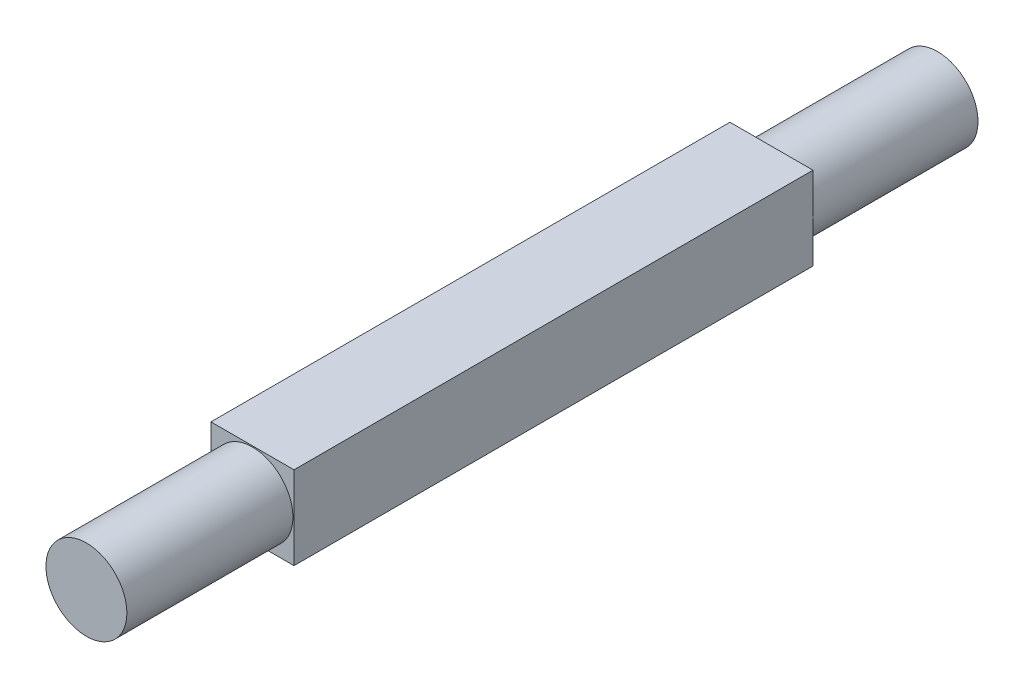
ISO-10303-21;
HEADER;
FILE_DESCRIPTION(('STEP AP214'),'2;1');
FILE_NAME('part.step','',(''),(''),'','','');
FILE_SCHEMA(('AUTOMOTIVE_DESIGN { 1 0 10303 214 1 1 1 1 }'));
ENDSEC;
DATA;
#1=APPLICATION_CONTEXT('core data for automotive mechanical design processes');
#2=APPLICATION_PROTOCOL_DEFINITION('international standard','automotive_design',2000,#1);
#3=PRODUCT_CONTEXT('',#1,'mechanical');
#4=PRODUCT('Part','Part','',(#3));
#5=PRODUCT_RELATED_PRODUCT_CATEGORY('part','',(#4));
#6=PRODUCT_DEFINITION_FORMATION('','',#4);
#7=PRODUCT_DEFINITION_CONTEXT('part definition',#1,'design');
#8=PRODUCT_DEFINITION('design','',#6,#7);
#9=PRODUCT_DEFINITION_SHAPE('','',#8);
#10=(LENGTH_UNIT() NAMED_UNIT(*) SI_UNIT(.MILLI.,.METRE.));
#11=(NAMED_UNIT(*) PLANE_ANGLE_UNIT() SI_UNIT($,.RADIAN.));
#12=(NAMED_UNIT(*) SI_UNIT($,.STERADIAN.) SOLID_ANGLE_UNIT());
#13=UNCERTAINTY_MEASURE_WITH_UNIT(LENGTH_MEASURE(1.E-05),#10,'distance_accuracy_value','');
#14=(GEOMETRIC_REPRESENTATION_CONTEXT(3) GLOBAL_UNCERTAINTY_ASSIGNED_CONTEXT((#13)) GLOBAL_UNIT_ASSIGNED_CONTEXT((#10,
#11,#12)) REPRESENTATION_CONTEXT('',''));
#15=CARTESIAN_POINT('',(0.,0.,0.));
#16=DIRECTION('',(0.,0.,1.));
#17=DIRECTION('',(1.,0.,0.));
#18=AXIS2_PLACEMENT_3D('',#15,#16,#17);
#19=CARTESIAN_POINT('',(-2.,-2.,12.5));
#20=DIRECTION('',(1.,0.,0.));
#21=DIRECTION('',(0.,0.,-1.));
#22=AXIS2_PLACEMENT_3D('',#19,#20,#21);
#23=PLANE('',#22);
#24=DIRECTION('',(0.,-1.,0.));
#25=VECTOR('',#24,1.);
#26=CARTESIAN_POINT('',(-2.,-2.,-12.5));
#27=LINE('',#26,#25);
#28=CARTESIAN_POINT('',(-2.,2.,-12.5));
#29=VERTEX_POINT('',#28);
#30=CARTESIAN_POINT('',(-2.,-2.,-12.5));
#31=VERTEX_POINT('',#30);
#32=EDGE_CURVE('E105',#29,#31,#27,.T.);
#33=ORIENTED_EDGE('',*,*,#32,.T.);
#34=DIRECTION('',(0.,0.,-1.));
#35=VECTOR('',#34,1.);
#36=CARTESIAN_POINT('',(-2.,-2.,12.5));
#37=LINE('',#36,#35);
#38=CARTESIAN_POINT('',(-2.,-2.,12.5));
#39=VERTEX_POINT('',#38);
#40=EDGE_CURVE('E42',#39,#31,#37,.T.);
#41=ORIENTED_EDGE('',*,*,#40,.F.);
#42=DIRECTION('',(0.,-1.,0.));
#43=VECTOR('',#42,1.);
#44=CARTESIAN_POINT('',(-2.,-2.,12.5));
#45=LINE('',#44,#43);
#46=CARTESIAN_POINT('',(-2.,2.,12.5));
#47=VERTEX_POINT('',#46);
#48=EDGE_CURVE('E92',#47,#39,#45,.T.);
#49=ORIENTED_EDGE('',*,*,#48,.F.);
#50=DIRECTION('',(0.,0.,-1.));
#51=VECTOR('',#50,1.);
#52=CARTESIAN_POINT('',(-2.,2.,12.5));
#53=LINE('',#52,#51);
#54=EDGE_CURVE('E101',#47,#29,#53,.T.);
#55=ORIENTED_EDGE('',*,*,#54,.T.);
#56=EDGE_LOOP('',(#33,#41,#49,#55));
#57=FACE_BOUND('',#56,.T.);
#58=ADVANCED_FACE('F39',(#57),#23,.F.);
#59=CARTESIAN_POINT('',(2.,-2.,12.5));
#60=DIRECTION('',(0.,1.,0.));
#61=DIRECTION('',(-1.,0.,0.));
#62=AXIS2_PLACEMENT_3D('',#59,#60,#61);
#63=PLANE('',#62);
#64=DIRECTION('',(1.,0.,0.));
#65=VECTOR('',#64,1.);
#66=CARTESIAN_POINT('',(2.,-2.,-12.5));
#67=LINE('',#66,#65);
#68=CARTESIAN_POINT('',(2.,-2.,-12.5));
#69=VERTEX_POINT('',#68);
#70=EDGE_CURVE('E97',#31,#69,#67,.T.);
#71=ORIENTED_EDGE('',*,*,#70,.T.);
#72=DIRECTION('',(0.,0.,-1.));
#73=VECTOR('',#72,1.);
#74=CARTESIAN_POINT('',(2.,-2.,12.5));
#75=LINE('',#74,#73);
#76=CARTESIAN_POINT('',(2.,-2.,12.5));
#77=VERTEX_POINT('',#76);
#78=EDGE_CURVE('E95',#77,#69,#75,.T.);
#79=ORIENTED_EDGE('',*,*,#78,.F.);
#80=DIRECTION('',(1.,0.,0.));
#81=VECTOR('',#80,1.);
#82=CARTESIAN_POINT('',(2.,-2.,12.5));
#83=LINE('',#82,#81);
#84=EDGE_CURVE('E87',#39,#77,#83,.T.);
#85=ORIENTED_EDGE('',*,*,#84,.F.);
#86=ORIENTED_EDGE('',*,*,#40,.T.);
#87=EDGE_LOOP('',(#71,#79,#85,#86));
#88=FACE_BOUND('',#87,.T.);
#89=ADVANCED_FACE('F96',(#88),#63,.F.);
#90=CARTESIAN_POINT('',(2.,-2.,12.5));
#91=DIRECTION('',(-1.,0.,0.));
#92=DIRECTION('',(0.,0.,1.));
#93=AXIS2_PLACEMENT_3D('',#90,#91,#92);
#94=PLANE('',#93);
#95=DIRECTION('',(0.,1.,0.));
#96=VECTOR('',#95,1.);
#97=CARTESIAN_POINT('',(2.,-2.,-12.5));
#98=LINE('',#97,#96);
#99=CARTESIAN_POINT('',(2.,2.,-12.5));
#100=VERTEX_POINT('',#99);
#101=EDGE_CURVE('E73',#69,#100,#98,.T.);
#102=ORIENTED_EDGE('',*,*,#101,.T.);
#103=DIRECTION('',(0.,0.,-1.));
#104=VECTOR('',#103,1.);
#105=CARTESIAN_POINT('',(2.,2.,12.5));
#106=LINE('',#105,#104);
#107=CARTESIAN_POINT('',(2.,2.,12.5));
#108=VERTEX_POINT('',#107);
#109=EDGE_CURVE('E98',#108,#100,#106,.T.);
#110=ORIENTED_EDGE('',*,*,#109,.F.);
#111=DIRECTION('',(0.,1.,0.));
#112=VECTOR('',#111,1.);
#113=CARTESIAN_POINT('',(2.,-2.,12.5));
#114=LINE('',#113,#112);
#115=EDGE_CURVE('E90',#77,#108,#114,.T.);
#116=ORIENTED_EDGE('',*,*,#115,.F.);
#117=ORIENTED_EDGE('',*,*,#78,.T.);
#118=EDGE_LOOP('',(#102,#110,#116,#117));
#119=FACE_BOUND('',#118,.T.);
#120=ADVANCED_FACE('F99',(#119),#94,.F.);
#121=CARTESIAN_POINT('',(2.,2.,12.5));
#122=DIRECTION('',(0.,-1.,0.));
#123=DIRECTION('',(1.,0.,0.));
#124=AXIS2_PLACEMENT_3D('',#121,#122,#123);
#125=PLANE('',#124);
#126=DIRECTION('',(-1.,0.,0.));
#127=VECTOR('',#126,1.);
#128=CARTESIAN_POINT('',(2.,2.,-12.5));
#129=LINE('',#128,#127);
#130=EDGE_CURVE('E79',#100,#29,#129,.T.);
#131=ORIENTED_EDGE('',*,*,#130,.T.);
#132=ORIENTED_EDGE('',*,*,#54,.F.);
#133=DIRECTION('',(-1.,0.,0.));
#134=VECTOR('',#133,1.);
#135=CARTESIAN_POINT('',(2.,2.,12.5));
#136=LINE('',#135,#134);
#137=EDGE_CURVE('E56',#108,#47,#136,.T.);
#138=ORIENTED_EDGE('',*,*,#137,.F.);
#139=ORIENTED_EDGE('',*,*,#109,.T.);
#140=EDGE_LOOP('',(#131,#132,#138,#139));
#141=FACE_BOUND('',#140,.T.);
#142=ADVANCED_FACE('F113',(#141),#125,.F.);
#143=CARTESIAN_POINT('',(0.,0.,12.5));
#144=DIRECTION('',(0.,0.,1.));
#145=DIRECTION('',(1.,0.,0.));
#146=AXIS2_PLACEMENT_3D('',#143,#144,#145);
#147=PLANE('',#146);
#148=CARTESIAN_POINT('',(0.,0.,12.5));
#149=DIRECTION('',(0.,0.,1.));
#150=DIRECTION('',(1.,0.,0.));
#151=AXIS2_PLACEMENT_3D('',#148,#149,#150);
#152=CIRCLE('',#151,1.95);
#153=CARTESIAN_POINT('',(1.95,0.,12.5));
#154=VERTEX_POINT('',#153);
#155=EDGE_CURVE('E11',#154,#154,#152,.T.);
#156=ORIENTED_EDGE('',*,*,#155,.F.);
#157=EDGE_LOOP('',(#156));
#158=FACE_BOUND('',#157,.T.);
#159=ORIENTED_EDGE('',*,*,#48,.T.);
#160=ORIENTED_EDGE('',*,*,#84,.T.);
#161=ORIENTED_EDGE('',*,*,#115,.T.);
#162=ORIENTED_EDGE('',*,*,#137,.T.);
#163=EDGE_LOOP('',(#159,#160,#161,#162));
#164=FACE_BOUND('',#163,.T.);
#165=ADVANCED_FACE('F88',(#158,#164),#147,.T.);
#166=CARTESIAN_POINT('',(0.,0.,-12.5));
#167=DIRECTION('',(0.,0.,1.));
#168=DIRECTION('',(1.,0.,0.));
#169=AXIS2_PLACEMENT_3D('',#166,#167,#168);
#170=PLANE('',#169);
#171=CARTESIAN_POINT('',(0.,0.,-12.5));
#172=DIRECTION('',(0.,0.,1.));
#173=DIRECTION('',(1.,0.,0.));
#174=AXIS2_PLACEMENT_3D('',#171,#172,#173);
#175=CIRCLE('',#174,1.95);
#176=CARTESIAN_POINT('',(1.95,0.,-12.5));
#177=VERTEX_POINT('',#176);
#178=EDGE_CURVE('E122',#177,#177,#175,.T.);
#179=ORIENTED_EDGE('',*,*,#178,.T.);
#180=EDGE_LOOP('',(#179));
#181=FACE_BOUND('',#180,.T.);
#182=ORIENTED_EDGE('',*,*,#32,.F.);
#183=ORIENTED_EDGE('',*,*,#130,.F.);
#184=ORIENTED_EDGE('',*,*,#101,.F.);
#185=ORIENTED_EDGE('',*,*,#70,.F.);
#186=EDGE_LOOP('',(#182,#183,#184,#185));
#187=FACE_BOUND('',#186,.T.);
#188=ADVANCED_FACE('F116',(#181,#187),#170,.F.);
#189=CARTESIAN_POINT('',(0.,0.,20.5));
#190=DIRECTION('',(0.,0.,-1.));
#191=DIRECTION('',(-1.,0.,0.));
#192=AXIS2_PLACEMENT_3D('',#189,#190,#191);
#193=CYLINDRICAL_SURFACE('',#192,1.95);
#194=CARTESIAN_POINT('',(0.,0.,20.5));
#195=DIRECTION('',(0.,0.,1.));
#196=DIRECTION('',(1.,0.,0.));
#197=AXIS2_PLACEMENT_3D('',#194,#195,#196);
#198=CIRCLE('',#197,1.95);
#199=CARTESIAN_POINT('',(1.95,0.,20.5));
#200=VERTEX_POINT('',#199);
#201=EDGE_CURVE('E108',#200,#200,#198,.T.);
#202=ORIENTED_EDGE('',*,*,#201,.F.);
#203=EDGE_LOOP('',(#202));
#204=FACE_BOUND('',#203,.T.);
#205=ORIENTED_EDGE('',*,*,#155,.T.);
#206=EDGE_LOOP('',(#205));
#207=FACE_BOUND('',#206,.T.);
#208=ADVANCED_FACE('F152',(#204,#207),#193,.T.);
#209=CARTESIAN_POINT('',(0.,0.,20.5));
#210=DIRECTION('',(0.,0.,1.));
#211=DIRECTION('',(1.,0.,0.));
#212=AXIS2_PLACEMENT_3D('',#209,#210,#211);
#213=PLANE('',#212);
#214=ORIENTED_EDGE('',*,*,#201,.T.);
#215=EDGE_LOOP('',(#214));
#216=FACE_BOUND('',#215,.T.);
#217=ADVANCED_FACE('F137',(#216),#213,.T.);
#218=CARTESIAN_POINT('',(0.,0.,-20.5));
#219=DIRECTION('',(0.,0.,1.));
#220=DIRECTION('',(1.,0.,0.));
#221=AXIS2_PLACEMENT_3D('',#218,#219,#220);
#222=CYLINDRICAL_SURFACE('',#221,1.95);
#223=CARTESIAN_POINT('',(0.,0.,-20.5));
#224=DIRECTION('',(0.,0.,1.));
#225=DIRECTION('',(1.,0.,0.));
#226=AXIS2_PLACEMENT_3D('',#223,#224,#225);
#227=CIRCLE('',#226,1.95);
#228=CARTESIAN_POINT('',(1.95,0.,-20.5));
#229=VERTEX_POINT('',#228);
#230=EDGE_CURVE('E121',#229,#229,#227,.T.);
#231=ORIENTED_EDGE('',*,*,#230,.T.);
#232=EDGE_LOOP('',(#231));
#233=FACE_BOUND('',#232,.T.);
#234=ORIENTED_EDGE('',*,*,#178,.F.);
#235=EDGE_LOOP('',(#234));
#236=FACE_BOUND('',#235,.T.);
#237=ADVANCED_FACE('F128',(#233,#236),#222,.T.);
#238=CARTESIAN_POINT('',(0.,0.,-20.5));
#239=DIRECTION('',(0.,0.,-1.));
#240=DIRECTION('',(1.,0.,0.));
#241=AXIS2_PLACEMENT_3D('',#238,#239,#240);
#242=PLANE('',#241);
#243=ORIENTED_EDGE('',*,*,#230,.F.);
#244=EDGE_LOOP('',(#243));
#245=FACE_BOUND('',#244,.T.);
#246=ADVANCED_FACE('F131',(#245),#242,.T.);
#247=CLOSED_SHELL('',(#58,#89,#120,#142,#165,#188,#208,#217,#237,#246));
#248=MANIFOLD_SOLID_BREP('B2',#247);
#249=ADVANCED_BREP_SHAPE_REPRESENTATION('',(#18,#248),#14);
#250=SHAPE_DEFINITION_REPRESENTATION(#9,#249);
ENDSEC;
END-ISO-10303-21;
